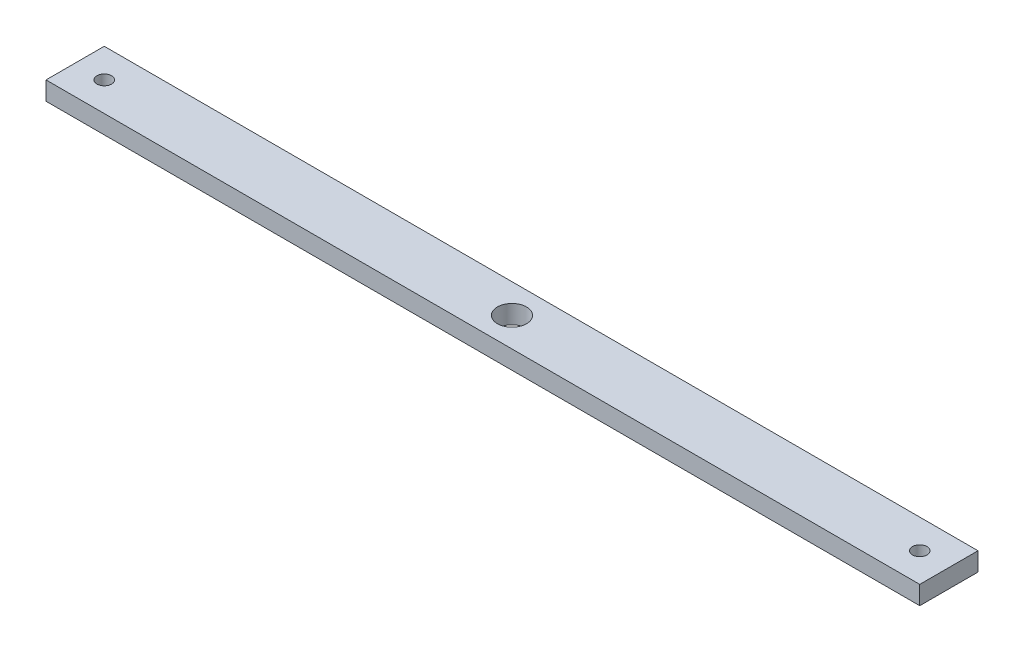
ISO-10303-21;
HEADER;
FILE_DESCRIPTION(('STEP AP214'),'2;1');
FILE_NAME('part.step','',(''),(''),'','','');
FILE_SCHEMA(('AUTOMOTIVE_DESIGN { 1 0 10303 214 1 1 1 1 }'));
ENDSEC;
DATA;
#1=APPLICATION_CONTEXT('core data for automotive mechanical design processes');
#2=APPLICATION_PROTOCOL_DEFINITION('international standard','automotive_design',2000,#1);
#3=PRODUCT_CONTEXT('',#1,'mechanical');
#4=PRODUCT('Part','Part','',(#3));
#5=PRODUCT_RELATED_PRODUCT_CATEGORY('part','',(#4));
#6=PRODUCT_DEFINITION_FORMATION('','',#4);
#7=PRODUCT_DEFINITION_CONTEXT('part definition',#1,'design');
#8=PRODUCT_DEFINITION('design','',#6,#7);
#9=PRODUCT_DEFINITION_SHAPE('','',#8);
#10=(LENGTH_UNIT() NAMED_UNIT(*) SI_UNIT(.MILLI.,.METRE.));
#11=(NAMED_UNIT(*) PLANE_ANGLE_UNIT() SI_UNIT($,.RADIAN.));
#12=(NAMED_UNIT(*) SI_UNIT($,.STERADIAN.) SOLID_ANGLE_UNIT());
#13=UNCERTAINTY_MEASURE_WITH_UNIT(LENGTH_MEASURE(1.E-05),#10,'distance_accuracy_value','');
#14=(GEOMETRIC_REPRESENTATION_CONTEXT(3) GLOBAL_UNCERTAINTY_ASSIGNED_CONTEXT((#13)) GLOBAL_UNIT_ASSIGNED_CONTEXT((#10,
#11,#12)) REPRESENTATION_CONTEXT('',''));
#15=CARTESIAN_POINT('',(0.,0.,0.));
#16=DIRECTION('',(0.,0.,1.));
#17=DIRECTION('',(1.,0.,0.));
#18=AXIS2_PLACEMENT_3D('',#15,#16,#17);
#19=CARTESIAN_POINT('',(0.,3.175,0.));
#20=DIRECTION('',(0.,-1.,0.));
#21=DIRECTION('',(0.,0.,-1.));
#22=AXIS2_PLACEMENT_3D('',#19,#20,#21);
#23=PLANE('',#22);
#24=DIRECTION('',(0.,0.,-1.));
#25=VECTOR('',#24,1.);
#26=CARTESIAN_POINT('',(150.,3.175,10.));
#27=LINE('',#26,#25);
#28=CARTESIAN_POINT('',(150.,3.175,10.));
#29=VERTEX_POINT('',#28);
#30=CARTESIAN_POINT('',(150.,3.175,-10.));
#31=VERTEX_POINT('',#30);
#32=EDGE_CURVE('E85',#29,#31,#27,.T.);
#33=ORIENTED_EDGE('',*,*,#32,.T.);
#34=DIRECTION('',(-1.,0.,0.));
#35=VECTOR('',#34,1.);
#36=CARTESIAN_POINT('',(-150.,3.175,-10.));
#37=LINE('',#36,#35);
#38=CARTESIAN_POINT('',(-150.,3.175,-10.));
#39=VERTEX_POINT('',#38);
#40=EDGE_CURVE('E80',#31,#39,#37,.T.);
#41=ORIENTED_EDGE('',*,*,#40,.T.);
#42=DIRECTION('',(0.,0.,1.));
#43=VECTOR('',#42,1.);
#44=CARTESIAN_POINT('',(-150.,3.175,10.));
#45=LINE('',#44,#43);
#46=CARTESIAN_POINT('',(-150.,3.175,10.));
#47=VERTEX_POINT('',#46);
#48=EDGE_CURVE('E83',#39,#47,#45,.T.);
#49=ORIENTED_EDGE('',*,*,#48,.T.);
#50=DIRECTION('',(1.,0.,0.));
#51=VECTOR('',#50,1.);
#52=CARTESIAN_POINT('',(-150.,3.175,10.));
#53=LINE('',#52,#51);
#54=EDGE_CURVE('E50',#47,#29,#53,.T.);
#55=ORIENTED_EDGE('',*,*,#54,.T.);
#56=EDGE_LOOP('',(#33,#41,#49,#55));
#57=FACE_BOUND('',#56,.T.);
#58=CARTESIAN_POINT('',(0.,3.175,0.));
#59=DIRECTION('',(0.,1.,0.));
#60=DIRECTION('',(0.,0.,1.));
#61=AXIS2_PLACEMENT_3D('',#58,#59,#60);
#62=CIRCLE('',#61,5.);
#63=CARTESIAN_POINT('',(0.,3.175,5.));
#64=VERTEX_POINT('',#63);
#65=EDGE_CURVE('E100',#64,#64,#62,.T.);
#66=ORIENTED_EDGE('',*,*,#65,.F.);
#67=EDGE_LOOP('',(#66));
#68=FACE_BOUND('',#67,.T.);
#69=CARTESIAN_POINT('',(-140.,3.175,0.));
#70=DIRECTION('',(0.,1.,0.));
#71=DIRECTION('',(0.,0.,1.));
#72=AXIS2_PLACEMENT_3D('',#69,#70,#71);
#73=CIRCLE('',#72,2.5);
#74=CARTESIAN_POINT('',(-140.,3.175,2.5));
#75=VERTEX_POINT('',#74);
#76=EDGE_CURVE('E115',#75,#75,#73,.T.);
#77=ORIENTED_EDGE('',*,*,#76,.F.);
#78=EDGE_LOOP('',(#77));
#79=FACE_BOUND('',#78,.T.);
#80=CARTESIAN_POINT('',(140.,3.175,0.));
#81=DIRECTION('',(0.,1.,0.));
#82=DIRECTION('',(0.,0.,1.));
#83=AXIS2_PLACEMENT_3D('',#80,#81,#82);
#84=CIRCLE('',#83,2.5);
#85=CARTESIAN_POINT('',(140.,3.175,2.5));
#86=VERTEX_POINT('',#85);
#87=EDGE_CURVE('E121',#86,#86,#84,.T.);
#88=ORIENTED_EDGE('',*,*,#87,.F.);
#89=EDGE_LOOP('',(#88));
#90=FACE_BOUND('',#89,.T.);
#91=ADVANCED_FACE('F33',(#57,#68,#79,#90),#23,.F.);
#92=CARTESIAN_POINT('',(0.,-3.175,0.));
#93=DIRECTION('',(0.,-1.,0.));
#94=DIRECTION('',(0.,0.,-1.));
#95=AXIS2_PLACEMENT_3D('',#92,#93,#94);
#96=PLANE('',#95);
#97=CARTESIAN_POINT('',(-140.,-3.175,0.));
#98=DIRECTION('',(0.,1.,0.));
#99=DIRECTION('',(0.,0.,1.));
#100=AXIS2_PLACEMENT_3D('',#97,#98,#99);
#101=CIRCLE('',#100,2.5);
#102=CARTESIAN_POINT('',(-140.,-3.175,2.5));
#103=VERTEX_POINT('',#102);
#104=EDGE_CURVE('E118',#103,#103,#101,.T.);
#105=ORIENTED_EDGE('',*,*,#104,.T.);
#106=EDGE_LOOP('',(#105));
#107=FACE_BOUND('',#106,.T.);
#108=DIRECTION('',(0.,0.,-1.));
#109=VECTOR('',#108,1.);
#110=CARTESIAN_POINT('',(150.,-3.175,10.));
#111=LINE('',#110,#109);
#112=CARTESIAN_POINT('',(150.,-3.175,10.));
#113=VERTEX_POINT('',#112);
#114=CARTESIAN_POINT('',(150.,-3.175,-10.));
#115=VERTEX_POINT('',#114);
#116=EDGE_CURVE('E97',#113,#115,#111,.T.);
#117=ORIENTED_EDGE('',*,*,#116,.F.);
#118=DIRECTION('',(1.,0.,0.));
#119=VECTOR('',#118,1.);
#120=CARTESIAN_POINT('',(-150.,-3.175,10.));
#121=LINE('',#120,#119);
#122=CARTESIAN_POINT('',(-150.,-3.175,10.));
#123=VERTEX_POINT('',#122);
#124=EDGE_CURVE('E73',#123,#113,#121,.T.);
#125=ORIENTED_EDGE('',*,*,#124,.F.);
#126=DIRECTION('',(0.,0.,1.));
#127=VECTOR('',#126,1.);
#128=CARTESIAN_POINT('',(-150.,-3.175,10.));
#129=LINE('',#128,#127);
#130=CARTESIAN_POINT('',(-150.,-3.175,-10.));
#131=VERTEX_POINT('',#130);
#132=EDGE_CURVE('E67',#131,#123,#129,.T.);
#133=ORIENTED_EDGE('',*,*,#132,.F.);
#134=DIRECTION('',(-1.,0.,0.));
#135=VECTOR('',#134,1.);
#136=CARTESIAN_POINT('',(-150.,-3.175,-10.));
#137=LINE('',#136,#135);
#138=EDGE_CURVE('E89',#115,#131,#137,.T.);
#139=ORIENTED_EDGE('',*,*,#138,.F.);
#140=EDGE_LOOP('',(#117,#125,#133,#139));
#141=FACE_BOUND('',#140,.T.);
#142=CARTESIAN_POINT('',(0.,-3.175,0.));
#143=DIRECTION('',(0.,1.,0.));
#144=DIRECTION('',(0.,0.,1.));
#145=AXIS2_PLACEMENT_3D('',#142,#143,#144);
#146=CIRCLE('',#145,5.);
#147=CARTESIAN_POINT('',(0.,-3.175,5.));
#148=VERTEX_POINT('',#147);
#149=EDGE_CURVE('E112',#148,#148,#146,.T.);
#150=ORIENTED_EDGE('',*,*,#149,.T.);
#151=EDGE_LOOP('',(#150));
#152=FACE_BOUND('',#151,.T.);
#153=CARTESIAN_POINT('',(140.,-3.175,0.));
#154=DIRECTION('',(0.,1.,0.));
#155=DIRECTION('',(0.,0.,1.));
#156=AXIS2_PLACEMENT_3D('',#153,#154,#155);
#157=CIRCLE('',#156,2.5);
#158=CARTESIAN_POINT('',(140.,-3.175,2.5));
#159=VERTEX_POINT('',#158);
#160=EDGE_CURVE('E124',#159,#159,#157,.T.);
#161=ORIENTED_EDGE('',*,*,#160,.T.);
#162=EDGE_LOOP('',(#161));
#163=FACE_BOUND('',#162,.T.);
#164=ADVANCED_FACE('F108',(#107,#141,#152,#163),#96,.T.);
#165=CARTESIAN_POINT('',(150.,3.175,10.));
#166=DIRECTION('',(-1.,0.,0.));
#167=DIRECTION('',(0.,0.,1.));
#168=AXIS2_PLACEMENT_3D('',#165,#166,#167);
#169=PLANE('',#168);
#170=ORIENTED_EDGE('',*,*,#116,.T.);
#171=DIRECTION('',(0.,-1.,0.));
#172=VECTOR('',#171,1.);
#173=CARTESIAN_POINT('',(150.,3.175,-10.));
#174=LINE('',#173,#172);
#175=EDGE_CURVE('E11',#31,#115,#174,.T.);
#176=ORIENTED_EDGE('',*,*,#175,.F.);
#177=ORIENTED_EDGE('',*,*,#32,.F.);
#178=DIRECTION('',(0.,-1.,0.));
#179=VECTOR('',#178,1.);
#180=CARTESIAN_POINT('',(150.,3.175,10.));
#181=LINE('',#180,#179);
#182=EDGE_CURVE('E93',#29,#113,#181,.T.);
#183=ORIENTED_EDGE('',*,*,#182,.T.);
#184=EDGE_LOOP('',(#170,#176,#177,#183));
#185=FACE_BOUND('',#184,.T.);
#186=ADVANCED_FACE('F35',(#185),#169,.F.);
#187=CARTESIAN_POINT('',(-150.,3.175,-10.));
#188=DIRECTION('',(0.,0.,1.));
#189=DIRECTION('',(1.,0.,0.));
#190=AXIS2_PLACEMENT_3D('',#187,#188,#189);
#191=PLANE('',#190);
#192=ORIENTED_EDGE('',*,*,#138,.T.);
#193=DIRECTION('',(0.,-1.,0.));
#194=VECTOR('',#193,1.);
#195=CARTESIAN_POINT('',(-150.,3.175,-10.));
#196=LINE('',#195,#194);
#197=EDGE_CURVE('E42',#39,#131,#196,.T.);
#198=ORIENTED_EDGE('',*,*,#197,.F.);
#199=ORIENTED_EDGE('',*,*,#40,.F.);
#200=ORIENTED_EDGE('',*,*,#175,.T.);
#201=EDGE_LOOP('',(#192,#198,#199,#200));
#202=FACE_BOUND('',#201,.T.);
#203=ADVANCED_FACE('F88',(#202),#191,.F.);
#204=CARTESIAN_POINT('',(-150.,3.175,10.));
#205=DIRECTION('',(1.,0.,0.));
#206=DIRECTION('',(0.,0.,-1.));
#207=AXIS2_PLACEMENT_3D('',#204,#205,#206);
#208=PLANE('',#207);
#209=ORIENTED_EDGE('',*,*,#132,.T.);
#210=DIRECTION('',(0.,-1.,0.));
#211=VECTOR('',#210,1.);
#212=CARTESIAN_POINT('',(-150.,3.175,10.));
#213=LINE('',#212,#211);
#214=EDGE_CURVE('E90',#47,#123,#213,.T.);
#215=ORIENTED_EDGE('',*,*,#214,.F.);
#216=ORIENTED_EDGE('',*,*,#48,.F.);
#217=ORIENTED_EDGE('',*,*,#197,.T.);
#218=EDGE_LOOP('',(#209,#215,#216,#217));
#219=FACE_BOUND('',#218,.T.);
#220=ADVANCED_FACE('F91',(#219),#208,.F.);
#221=CARTESIAN_POINT('',(-150.,3.175,10.));
#222=DIRECTION('',(0.,0.,-1.));
#223=DIRECTION('',(-1.,0.,0.));
#224=AXIS2_PLACEMENT_3D('',#221,#222,#223);
#225=PLANE('',#224);
#226=ORIENTED_EDGE('',*,*,#124,.T.);
#227=ORIENTED_EDGE('',*,*,#182,.F.);
#228=ORIENTED_EDGE('',*,*,#54,.F.);
#229=ORIENTED_EDGE('',*,*,#214,.T.);
#230=EDGE_LOOP('',(#226,#227,#228,#229));
#231=FACE_BOUND('',#230,.T.);
#232=ADVANCED_FACE('F105',(#231),#225,.F.);
#233=CARTESIAN_POINT('',(0.,3.175,0.));
#234=DIRECTION('',(0.,-1.,0.));
#235=DIRECTION('',(0.,0.,-1.));
#236=AXIS2_PLACEMENT_3D('',#233,#234,#235);
#237=CYLINDRICAL_SURFACE('',#236,5.);
#238=ORIENTED_EDGE('',*,*,#65,.T.);
#239=EDGE_LOOP('',(#238));
#240=FACE_BOUND('',#239,.T.);
#241=ORIENTED_EDGE('',*,*,#149,.F.);
#242=EDGE_LOOP('',(#241));
#243=FACE_BOUND('',#242,.T.);
#244=ADVANCED_FACE('F141',(#240,#243),#237,.F.);
#245=CARTESIAN_POINT('',(-140.,3.175,0.));
#246=DIRECTION('',(0.,-1.,0.));
#247=DIRECTION('',(0.,0.,-1.));
#248=AXIS2_PLACEMENT_3D('',#245,#246,#247);
#249=CYLINDRICAL_SURFACE('',#248,2.5);
#250=ORIENTED_EDGE('',*,*,#76,.T.);
#251=EDGE_LOOP('',(#250));
#252=FACE_BOUND('',#251,.T.);
#253=ORIENTED_EDGE('',*,*,#104,.F.);
#254=EDGE_LOOP('',(#253));
#255=FACE_BOUND('',#254,.T.);
#256=ADVANCED_FACE('F187',(#252,#255),#249,.F.);
#257=CARTESIAN_POINT('',(140.,3.175,0.));
#258=DIRECTION('',(0.,-1.,0.));
#259=DIRECTION('',(0.,0.,-1.));
#260=AXIS2_PLACEMENT_3D('',#257,#258,#259);
#261=CYLINDRICAL_SURFACE('',#260,2.5);
#262=ORIENTED_EDGE('',*,*,#87,.T.);
#263=EDGE_LOOP('',(#262));
#264=FACE_BOUND('',#263,.T.);
#265=ORIENTED_EDGE('',*,*,#160,.F.);
#266=EDGE_LOOP('',(#265));
#267=FACE_BOUND('',#266,.T.);
#268=ADVANCED_FACE('F130',(#264,#267),#261,.F.);
#269=CLOSED_SHELL('',(#91,#164,#186,#203,#220,#232,#244,#256,#268));
#270=MANIFOLD_SOLID_BREP('B2',#269);
#271=ADVANCED_BREP_SHAPE_REPRESENTATION('',(#18,#270),#14);
#272=SHAPE_DEFINITION_REPRESENTATION(#9,#271);
ENDSEC;
END-ISO-10303-21;
